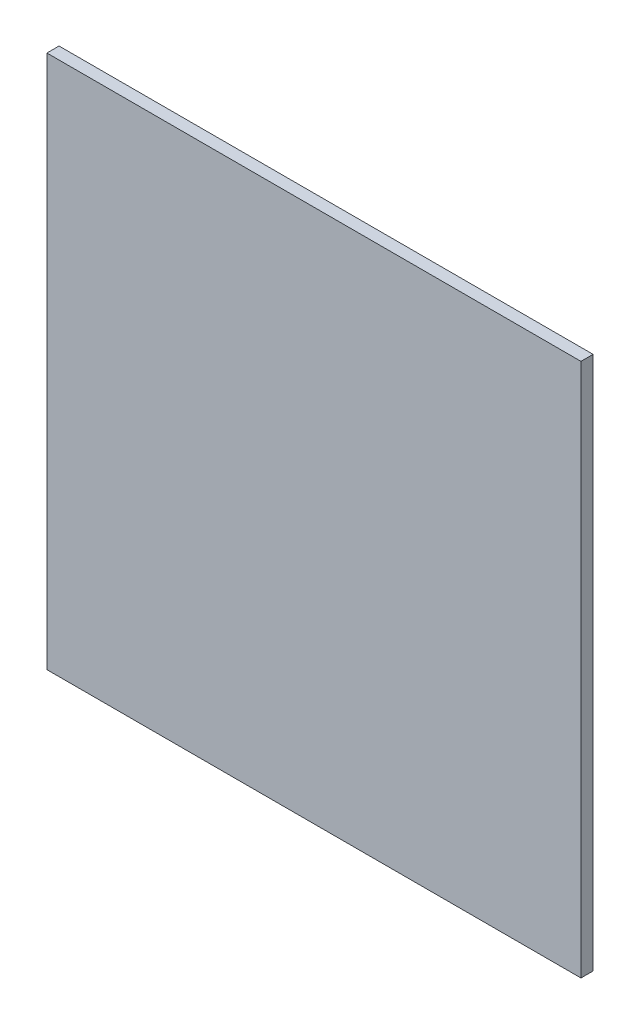
ISO-10303-21;
HEADER;
FILE_DESCRIPTION(('STEP AP214'),'2;1');
FILE_NAME('part.step','',(''),(''),'','','');
FILE_SCHEMA(('AUTOMOTIVE_DESIGN { 1 0 10303 214 1 1 1 1 }'));
ENDSEC;
DATA;
#1=APPLICATION_CONTEXT('core data for automotive mechanical design processes');
#2=APPLICATION_PROTOCOL_DEFINITION('international standard','automotive_design',2000,#1);
#3=PRODUCT_CONTEXT('',#1,'mechanical');
#4=PRODUCT('Part','Part','',(#3));
#5=PRODUCT_RELATED_PRODUCT_CATEGORY('part','',(#4));
#6=PRODUCT_DEFINITION_FORMATION('','',#4);
#7=PRODUCT_DEFINITION_CONTEXT('part definition',#1,'design');
#8=PRODUCT_DEFINITION('design','',#6,#7);
#9=PRODUCT_DEFINITION_SHAPE('','',#8);
#10=(LENGTH_UNIT() NAMED_UNIT(*) SI_UNIT(.MILLI.,.METRE.));
#11=(NAMED_UNIT(*) PLANE_ANGLE_UNIT() SI_UNIT($,.RADIAN.));
#12=(NAMED_UNIT(*) SI_UNIT($,.STERADIAN.) SOLID_ANGLE_UNIT());
#13=UNCERTAINTY_MEASURE_WITH_UNIT(LENGTH_MEASURE(1.E-05),#10,'distance_accuracy_value','');
#14=(GEOMETRIC_REPRESENTATION_CONTEXT(3) GLOBAL_UNCERTAINTY_ASSIGNED_CONTEXT((#13)) GLOBAL_UNIT_ASSIGNED_CONTEXT((#10,
#11,#12)) REPRESENTATION_CONTEXT('',''));
#15=CARTESIAN_POINT('',(0.,0.,0.));
#16=DIRECTION('',(0.,0.,1.));
#17=DIRECTION('',(1.,0.,0.));
#18=AXIS2_PLACEMENT_3D('',#15,#16,#17);
#19=CARTESIAN_POINT('',(-22.,-22.,1.));
#20=DIRECTION('',(1.,0.,0.));
#21=DIRECTION('',(0.,0.,-1.));
#22=AXIS2_PLACEMENT_3D('',#19,#20,#21);
#23=PLANE('',#22);
#24=DIRECTION('',(0.,-1.,0.));
#25=VECTOR('',#24,1.);
#26=CARTESIAN_POINT('',(-22.,-22.,0.));
#27=LINE('',#26,#25);
#28=CARTESIAN_POINT('',(-22.,22.,0.));
#29=VERTEX_POINT('',#28);
#30=CARTESIAN_POINT('',(-22.,-22.,0.));
#31=VERTEX_POINT('',#30);
#32=EDGE_CURVE('E96',#29,#31,#27,.T.);
#33=ORIENTED_EDGE('',*,*,#32,.T.);
#34=DIRECTION('',(0.,0.,-1.));
#35=VECTOR('',#34,1.);
#36=CARTESIAN_POINT('',(-22.,-22.,1.));
#37=LINE('',#36,#35);
#38=CARTESIAN_POINT('',(-22.,-22.,1.));
#39=VERTEX_POINT('',#38);
#40=EDGE_CURVE('E11',#39,#31,#37,.T.);
#41=ORIENTED_EDGE('',*,*,#40,.F.);
#42=DIRECTION('',(0.,-1.,0.));
#43=VECTOR('',#42,1.);
#44=CARTESIAN_POINT('',(-22.,-22.,1.));
#45=LINE('',#44,#43);
#46=CARTESIAN_POINT('',(-22.,22.,1.));
#47=VERTEX_POINT('',#46);
#48=EDGE_CURVE('E84',#47,#39,#45,.T.);
#49=ORIENTED_EDGE('',*,*,#48,.F.);
#50=DIRECTION('',(0.,0.,-1.));
#51=VECTOR('',#50,1.);
#52=CARTESIAN_POINT('',(-22.,22.,1.));
#53=LINE('',#52,#51);
#54=EDGE_CURVE('E92',#47,#29,#53,.T.);
#55=ORIENTED_EDGE('',*,*,#54,.T.);
#56=EDGE_LOOP('',(#33,#41,#49,#55));
#57=FACE_BOUND('',#56,.T.);
#58=ADVANCED_FACE('F33',(#57),#23,.F.);
#59=CARTESIAN_POINT('',(22.,-22.,1.));
#60=DIRECTION('',(0.,1.,0.));
#61=DIRECTION('',(-1.,0.,0.));
#62=AXIS2_PLACEMENT_3D('',#59,#60,#61);
#63=PLANE('',#62);
#64=DIRECTION('',(1.,0.,0.));
#65=VECTOR('',#64,1.);
#66=CARTESIAN_POINT('',(22.,-22.,0.));
#67=LINE('',#66,#65);
#68=CARTESIAN_POINT('',(22.,-22.,0.));
#69=VERTEX_POINT('',#68);
#70=EDGE_CURVE('E88',#31,#69,#67,.T.);
#71=ORIENTED_EDGE('',*,*,#70,.T.);
#72=DIRECTION('',(0.,0.,-1.));
#73=VECTOR('',#72,1.);
#74=CARTESIAN_POINT('',(22.,-22.,1.));
#75=LINE('',#74,#73);
#76=CARTESIAN_POINT('',(22.,-22.,1.));
#77=VERTEX_POINT('',#76);
#78=EDGE_CURVE('E41',#77,#69,#75,.T.);
#79=ORIENTED_EDGE('',*,*,#78,.F.);
#80=DIRECTION('',(1.,0.,0.));
#81=VECTOR('',#80,1.);
#82=CARTESIAN_POINT('',(22.,-22.,1.));
#83=LINE('',#82,#81);
#84=EDGE_CURVE('E79',#39,#77,#83,.T.);
#85=ORIENTED_EDGE('',*,*,#84,.F.);
#86=ORIENTED_EDGE('',*,*,#40,.T.);
#87=EDGE_LOOP('',(#71,#79,#85,#86));
#88=FACE_BOUND('',#87,.T.);
#89=ADVANCED_FACE('F87',(#88),#63,.F.);
#90=CARTESIAN_POINT('',(22.,-22.,1.));
#91=DIRECTION('',(-1.,0.,0.));
#92=DIRECTION('',(0.,-1.,0.));
#93=AXIS2_PLACEMENT_3D('',#90,#91,#92);
#94=PLANE('',#93);
#95=DIRECTION('',(0.,1.,0.));
#96=VECTOR('',#95,1.);
#97=CARTESIAN_POINT('',(22.,-22.,0.));
#98=LINE('',#97,#96);
#99=CARTESIAN_POINT('',(22.,22.,0.));
#100=VERTEX_POINT('',#99);
#101=EDGE_CURVE('E66',#69,#100,#98,.T.);
#102=ORIENTED_EDGE('',*,*,#101,.T.);
#103=DIRECTION('',(0.,0.,-1.));
#104=VECTOR('',#103,1.);
#105=CARTESIAN_POINT('',(22.,22.,1.));
#106=LINE('',#105,#104);
#107=CARTESIAN_POINT('',(22.,22.,1.));
#108=VERTEX_POINT('',#107);
#109=EDGE_CURVE('E89',#108,#100,#106,.T.);
#110=ORIENTED_EDGE('',*,*,#109,.F.);
#111=DIRECTION('',(0.,1.,0.));
#112=VECTOR('',#111,1.);
#113=CARTESIAN_POINT('',(22.,-22.,1.));
#114=LINE('',#113,#112);
#115=EDGE_CURVE('E82',#77,#108,#114,.T.);
#116=ORIENTED_EDGE('',*,*,#115,.F.);
#117=ORIENTED_EDGE('',*,*,#78,.T.);
#118=EDGE_LOOP('',(#102,#110,#116,#117));
#119=FACE_BOUND('',#118,.T.);
#120=ADVANCED_FACE('F90',(#119),#94,.F.);
#121=CARTESIAN_POINT('',(22.,22.,1.));
#122=DIRECTION('',(0.,-1.,0.));
#123=DIRECTION('',(1.,0.,0.));
#124=AXIS2_PLACEMENT_3D('',#121,#122,#123);
#125=PLANE('',#124);
#126=DIRECTION('',(-1.,0.,0.));
#127=VECTOR('',#126,1.);
#128=CARTESIAN_POINT('',(22.,22.,0.));
#129=LINE('',#128,#127);
#130=EDGE_CURVE('E72',#100,#29,#129,.T.);
#131=ORIENTED_EDGE('',*,*,#130,.T.);
#132=ORIENTED_EDGE('',*,*,#54,.F.);
#133=DIRECTION('',(-1.,0.,0.));
#134=VECTOR('',#133,1.);
#135=CARTESIAN_POINT('',(22.,22.,1.));
#136=LINE('',#135,#134);
#137=EDGE_CURVE('E49',#108,#47,#136,.T.);
#138=ORIENTED_EDGE('',*,*,#137,.F.);
#139=ORIENTED_EDGE('',*,*,#109,.T.);
#140=EDGE_LOOP('',(#131,#132,#138,#139));
#141=FACE_BOUND('',#140,.T.);
#142=ADVANCED_FACE('F103',(#141),#125,.F.);
#143=CARTESIAN_POINT('',(0.,0.,1.));
#144=DIRECTION('',(0.,0.,1.));
#145=DIRECTION('',(1.,0.,0.));
#146=AXIS2_PLACEMENT_3D('',#143,#144,#145);
#147=PLANE('',#146);
#148=ORIENTED_EDGE('',*,*,#48,.T.);
#149=ORIENTED_EDGE('',*,*,#84,.T.);
#150=ORIENTED_EDGE('',*,*,#115,.T.);
#151=ORIENTED_EDGE('',*,*,#137,.T.);
#152=EDGE_LOOP('',(#148,#149,#150,#151));
#153=FACE_BOUND('',#152,.T.);
#154=ADVANCED_FACE('F80',(#153),#147,.T.);
#155=CARTESIAN_POINT('',(0.,0.,0.));
#156=DIRECTION('',(0.,0.,1.));
#157=DIRECTION('',(1.,0.,0.));
#158=AXIS2_PLACEMENT_3D('',#155,#156,#157);
#159=PLANE('',#158);
#160=ORIENTED_EDGE('',*,*,#32,.F.);
#161=ORIENTED_EDGE('',*,*,#130,.F.);
#162=ORIENTED_EDGE('',*,*,#101,.F.);
#163=ORIENTED_EDGE('',*,*,#70,.F.);
#164=EDGE_LOOP('',(#160,#161,#162,#163));
#165=FACE_BOUND('',#164,.T.);
#166=ADVANCED_FACE('F106',(#165),#159,.F.);
#167=CLOSED_SHELL('',(#58,#89,#120,#142,#154,#166));
#168=MANIFOLD_SOLID_BREP('B2',#167);
#169=ADVANCED_BREP_SHAPE_REPRESENTATION('',(#18,#168),#14);
#170=SHAPE_DEFINITION_REPRESENTATION(#9,#169);
ENDSEC;
END-ISO-10303-21;
